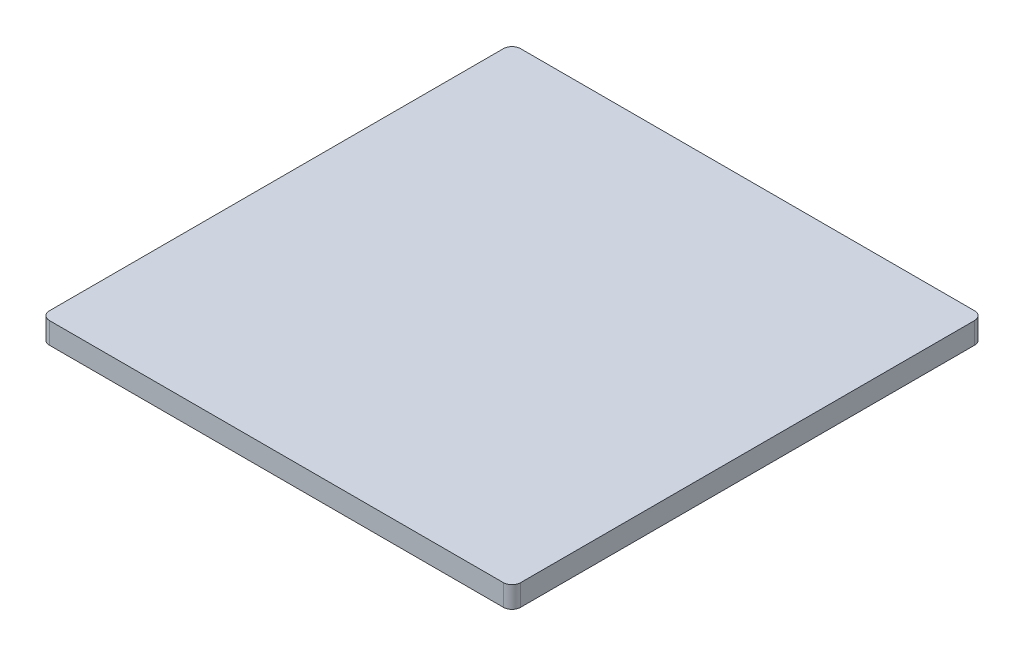
ISO-10303-21;
HEADER;
FILE_DESCRIPTION(('STEP AP214'),'2;1');
FILE_NAME('part.step','',(''),(''),'','','');
FILE_SCHEMA(('AUTOMOTIVE_DESIGN { 1 0 10303 214 1 1 1 1 }'));
ENDSEC;
DATA;
#1=APPLICATION_CONTEXT('core data for automotive mechanical design processes');
#2=APPLICATION_PROTOCOL_DEFINITION('international standard','automotive_design',2000,#1);
#3=PRODUCT_CONTEXT('',#1,'mechanical');
#4=PRODUCT('Part','Part','',(#3));
#5=PRODUCT_RELATED_PRODUCT_CATEGORY('part','',(#4));
#6=PRODUCT_DEFINITION_FORMATION('','',#4);
#7=PRODUCT_DEFINITION_CONTEXT('part definition',#1,'design');
#8=PRODUCT_DEFINITION('design','',#6,#7);
#9=PRODUCT_DEFINITION_SHAPE('','',#8);
#10=(LENGTH_UNIT() NAMED_UNIT(*) SI_UNIT(.MILLI.,.METRE.));
#11=(NAMED_UNIT(*) PLANE_ANGLE_UNIT() SI_UNIT($,.RADIAN.));
#12=(NAMED_UNIT(*) SI_UNIT($,.STERADIAN.) SOLID_ANGLE_UNIT());
#13=UNCERTAINTY_MEASURE_WITH_UNIT(LENGTH_MEASURE(1.E-05),#10,'distance_accuracy_value','');
#14=(GEOMETRIC_REPRESENTATION_CONTEXT(3) GLOBAL_UNCERTAINTY_ASSIGNED_CONTEXT((#13)) GLOBAL_UNIT_ASSIGNED_CONTEXT((#10,
#11,#12)) REPRESENTATION_CONTEXT('',''));
#15=CARTESIAN_POINT('',(0.,0.,0.));
#16=DIRECTION('',(0.,0.,1.));
#17=DIRECTION('',(1.,0.,0.));
#18=AXIS2_PLACEMENT_3D('',#15,#16,#17);
#19=CARTESIAN_POINT('',(54.,2.5,-1.));
#20=DIRECTION('',(0.,-1.,0.));
#21=DIRECTION('',(0.,0.,-1.));
#22=AXIS2_PLACEMENT_3D('',#19,#20,#21);
#23=CYLINDRICAL_SURFACE('',#22,1.);
#24=CARTESIAN_POINT('',(54.,0.,-1.));
#25=DIRECTION('',(0.,1.,0.));
#26=DIRECTION('',(0.,0.,1.));
#27=AXIS2_PLACEMENT_3D('',#24,#25,#26);
#28=CIRCLE('',#27,1.);
#29=CARTESIAN_POINT('',(54.,0.,0.));
#30=VERTEX_POINT('',#29);
#31=CARTESIAN_POINT('',(55.,0.,-1.));
#32=VERTEX_POINT('',#31);
#33=EDGE_CURVE('E137',#30,#32,#28,.T.);
#34=ORIENTED_EDGE('',*,*,#33,.T.);
#35=DIRECTION('',(0.,-1.,0.));
#36=VECTOR('',#35,1.);
#37=CARTESIAN_POINT('',(55.,2.5,-1.));
#38=LINE('',#37,#36);
#39=CARTESIAN_POINT('',(55.,2.5,-1.));
#40=VERTEX_POINT('',#39);
#41=EDGE_CURVE('E11',#40,#32,#38,.T.);
#42=ORIENTED_EDGE('',*,*,#41,.F.);
#43=CARTESIAN_POINT('',(54.,2.5,-1.));
#44=DIRECTION('',(0.,1.,0.));
#45=DIRECTION('',(0.,0.,1.));
#46=AXIS2_PLACEMENT_3D('',#43,#44,#45);
#47=CIRCLE('',#46,1.);
#48=CARTESIAN_POINT('',(54.,2.5,0.));
#49=VERTEX_POINT('',#48);
#50=EDGE_CURVE('E151',#49,#40,#47,.T.);
#51=ORIENTED_EDGE('',*,*,#50,.F.);
#52=DIRECTION('',(0.,-1.,0.));
#53=VECTOR('',#52,1.);
#54=CARTESIAN_POINT('',(54.,2.5,0.));
#55=LINE('',#54,#53);
#56=EDGE_CURVE('E133',#49,#30,#55,.T.);
#57=ORIENTED_EDGE('',*,*,#56,.T.);
#58=EDGE_LOOP('',(#34,#42,#51,#57));
#59=FACE_BOUND('',#58,.T.);
#60=ADVANCED_FACE('F41',(#59),#23,.T.);
#61=CARTESIAN_POINT('',(55.,2.5,-1.));
#62=DIRECTION('',(-1.,0.,0.));
#63=DIRECTION('',(0.,0.,1.));
#64=AXIS2_PLACEMENT_3D('',#61,#62,#63);
#65=PLANE('',#64);
#66=DIRECTION('',(0.,0.,-1.));
#67=VECTOR('',#66,1.);
#68=CARTESIAN_POINT('',(55.,0.,-1.));
#69=LINE('',#68,#67);
#70=CARTESIAN_POINT('',(55.,0.,-54.));
#71=VERTEX_POINT('',#70);
#72=EDGE_CURVE('E140',#32,#71,#69,.T.);
#73=ORIENTED_EDGE('',*,*,#72,.T.);
#74=DIRECTION('',(0.,-1.,0.));
#75=VECTOR('',#74,1.);
#76=CARTESIAN_POINT('',(55.,2.5,-54.));
#77=LINE('',#76,#75);
#78=CARTESIAN_POINT('',(55.,2.5,-54.));
#79=VERTEX_POINT('',#78);
#80=EDGE_CURVE('E49',#79,#71,#77,.T.);
#81=ORIENTED_EDGE('',*,*,#80,.F.);
#82=DIRECTION('',(0.,0.,-1.));
#83=VECTOR('',#82,1.);
#84=CARTESIAN_POINT('',(55.,2.5,-1.));
#85=LINE('',#84,#83);
#86=EDGE_CURVE('E100',#40,#79,#85,.T.);
#87=ORIENTED_EDGE('',*,*,#86,.F.);
#88=ORIENTED_EDGE('',*,*,#41,.T.);
#89=EDGE_LOOP('',(#73,#81,#87,#88));
#90=FACE_BOUND('',#89,.T.);
#91=ADVANCED_FACE('F186',(#90),#65,.F.);
#92=CARTESIAN_POINT('',(54.,2.5,-54.));
#93=DIRECTION('',(0.,-1.,0.));
#94=DIRECTION('',(0.,0.,-1.));
#95=AXIS2_PLACEMENT_3D('',#92,#93,#94);
#96=CYLINDRICAL_SURFACE('',#95,1.);
#97=CARTESIAN_POINT('',(54.,0.,-54.));
#98=DIRECTION('',(0.,1.,0.));
#99=DIRECTION('',(0.,0.,-1.));
#100=AXIS2_PLACEMENT_3D('',#97,#98,#99);
#101=CIRCLE('',#100,1.);
#102=CARTESIAN_POINT('',(54.,0.,-55.));
#103=VERTEX_POINT('',#102);
#104=EDGE_CURVE('E142',#71,#103,#101,.T.);
#105=ORIENTED_EDGE('',*,*,#104,.T.);
#106=DIRECTION('',(0.,-1.,0.));
#107=VECTOR('',#106,1.);
#108=CARTESIAN_POINT('',(54.,2.5,-55.));
#109=LINE('',#108,#107);
#110=CARTESIAN_POINT('',(54.,2.5,-55.));
#111=VERTEX_POINT('',#110);
#112=EDGE_CURVE('E158',#111,#103,#109,.T.);
#113=ORIENTED_EDGE('',*,*,#112,.F.);
#114=CARTESIAN_POINT('',(54.,2.5,-54.));
#115=DIRECTION('',(0.,1.,0.));
#116=DIRECTION('',(0.,0.,-1.));
#117=AXIS2_PLACEMENT_3D('',#114,#115,#116);
#118=CIRCLE('',#117,1.);
#119=EDGE_CURVE('E166',#79,#111,#118,.T.);
#120=ORIENTED_EDGE('',*,*,#119,.F.);
#121=ORIENTED_EDGE('',*,*,#80,.T.);
#122=EDGE_LOOP('',(#105,#113,#120,#121));
#123=FACE_BOUND('',#122,.T.);
#124=ADVANCED_FACE('F164',(#123),#96,.T.);
#125=CARTESIAN_POINT('',(1.,2.5,-55.));
#126=DIRECTION('',(0.,0.,1.));
#127=DIRECTION('',(1.,0.,0.));
#128=AXIS2_PLACEMENT_3D('',#125,#126,#127);
#129=PLANE('',#128);
#130=DIRECTION('',(-1.,0.,0.));
#131=VECTOR('',#130,1.);
#132=CARTESIAN_POINT('',(1.,0.,-55.));
#133=LINE('',#132,#131);
#134=CARTESIAN_POINT('',(1.,0.,-55.));
#135=VERTEX_POINT('',#134);
#136=EDGE_CURVE('E144',#103,#135,#133,.T.);
#137=ORIENTED_EDGE('',*,*,#136,.T.);
#138=DIRECTION('',(0.,-1.,0.));
#139=VECTOR('',#138,1.);
#140=CARTESIAN_POINT('',(1.,2.5,-55.));
#141=LINE('',#140,#139);
#142=CARTESIAN_POINT('',(1.,2.5,-55.));
#143=VERTEX_POINT('',#142);
#144=EDGE_CURVE('E155',#143,#135,#141,.T.);
#145=ORIENTED_EDGE('',*,*,#144,.F.);
#146=DIRECTION('',(-1.,0.,0.));
#147=VECTOR('',#146,1.);
#148=CARTESIAN_POINT('',(1.,2.5,-55.));
#149=LINE('',#148,#147);
#150=EDGE_CURVE('E178',#111,#143,#149,.T.);
#151=ORIENTED_EDGE('',*,*,#150,.F.);
#152=ORIENTED_EDGE('',*,*,#112,.T.);
#153=EDGE_LOOP('',(#137,#145,#151,#152));
#154=FACE_BOUND('',#153,.T.);
#155=ADVANCED_FACE('F174',(#154),#129,.F.);
#156=CARTESIAN_POINT('',(1.,2.5,-54.));
#157=DIRECTION('',(0.,-1.,0.));
#158=DIRECTION('',(0.,0.,-1.));
#159=AXIS2_PLACEMENT_3D('',#156,#157,#158);
#160=CYLINDRICAL_SURFACE('',#159,1.);
#161=CARTESIAN_POINT('',(1.,0.,-54.));
#162=DIRECTION('',(0.,1.,0.));
#163=DIRECTION('',(0.,0.,-1.));
#164=AXIS2_PLACEMENT_3D('',#161,#162,#163);
#165=CIRCLE('',#164,1.);
#166=CARTESIAN_POINT('',(0.,0.,-54.));
#167=VERTEX_POINT('',#166);
#168=EDGE_CURVE('E146',#135,#167,#165,.T.);
#169=ORIENTED_EDGE('',*,*,#168,.T.);
#170=DIRECTION('',(0.,-1.,0.));
#171=VECTOR('',#170,1.);
#172=CARTESIAN_POINT('',(0.,2.5,-54.));
#173=LINE('',#172,#171);
#174=CARTESIAN_POINT('',(0.,2.5,-54.));
#175=VERTEX_POINT('',#174);
#176=EDGE_CURVE('E128',#175,#167,#173,.T.);
#177=ORIENTED_EDGE('',*,*,#176,.F.);
#178=CARTESIAN_POINT('',(1.,2.5,-54.));
#179=DIRECTION('',(0.,1.,0.));
#180=DIRECTION('',(0.,0.,-1.));
#181=AXIS2_PLACEMENT_3D('',#178,#179,#180);
#182=CIRCLE('',#181,1.);
#183=EDGE_CURVE('E119',#143,#175,#182,.T.);
#184=ORIENTED_EDGE('',*,*,#183,.F.);
#185=ORIENTED_EDGE('',*,*,#144,.T.);
#186=EDGE_LOOP('',(#169,#177,#184,#185));
#187=FACE_BOUND('',#186,.T.);
#188=ADVANCED_FACE('F177',(#187),#160,.T.);
#189=CARTESIAN_POINT('',(0.,2.5,-1.00000000000001));
#190=DIRECTION('',(1.,0.,0.));
#191=DIRECTION('',(0.,0.,-1.));
#192=AXIS2_PLACEMENT_3D('',#189,#190,#191);
#193=PLANE('',#192);
#194=DIRECTION('',(0.,0.,1.));
#195=VECTOR('',#194,1.);
#196=CARTESIAN_POINT('',(0.,0.,-1.00000000000001));
#197=LINE('',#196,#195);
#198=CARTESIAN_POINT('',(0.,0.,-1.00000000000001));
#199=VERTEX_POINT('',#198);
#200=EDGE_CURVE('E127',#167,#199,#197,.T.);
#201=ORIENTED_EDGE('',*,*,#200,.T.);
#202=DIRECTION('',(0.,-1.,0.));
#203=VECTOR('',#202,1.);
#204=CARTESIAN_POINT('',(0.,2.5,-1.00000000000001));
#205=LINE('',#204,#203);
#206=CARTESIAN_POINT('',(0.,2.5,-1.00000000000001));
#207=VERTEX_POINT('',#206);
#208=EDGE_CURVE('E124',#207,#199,#205,.T.);
#209=ORIENTED_EDGE('',*,*,#208,.F.);
#210=DIRECTION('',(0.,0.,1.));
#211=VECTOR('',#210,1.);
#212=CARTESIAN_POINT('',(0.,2.5,-1.00000000000001));
#213=LINE('',#212,#211);
#214=EDGE_CURVE('E113',#175,#207,#213,.T.);
#215=ORIENTED_EDGE('',*,*,#214,.F.);
#216=ORIENTED_EDGE('',*,*,#176,.T.);
#217=EDGE_LOOP('',(#201,#209,#215,#216));
#218=FACE_BOUND('',#217,.T.);
#219=ADVANCED_FACE('F125',(#218),#193,.F.);
#220=CARTESIAN_POINT('',(1.,2.5,-1.));
#221=DIRECTION('',(0.,-1.,0.));
#222=DIRECTION('',(0.,0.,-1.));
#223=AXIS2_PLACEMENT_3D('',#220,#221,#222);
#224=CYLINDRICAL_SURFACE('',#223,1.);
#225=CARTESIAN_POINT('',(1.,0.,-1.));
#226=DIRECTION('',(0.,1.,0.));
#227=DIRECTION('',(0.,0.,-1.));
#228=AXIS2_PLACEMENT_3D('',#225,#226,#227);
#229=CIRCLE('',#228,1.);
#230=CARTESIAN_POINT('',(1.00000000000001,0.,0.));
#231=VERTEX_POINT('',#230);
#232=EDGE_CURVE('E86',#199,#231,#229,.T.);
#233=ORIENTED_EDGE('',*,*,#232,.T.);
#234=DIRECTION('',(0.,-1.,0.));
#235=VECTOR('',#234,1.);
#236=CARTESIAN_POINT('',(1.00000000000001,2.5,0.));
#237=LINE('',#236,#235);
#238=CARTESIAN_POINT('',(1.00000000000001,2.5,0.));
#239=VERTEX_POINT('',#238);
#240=EDGE_CURVE('E129',#239,#231,#237,.T.);
#241=ORIENTED_EDGE('',*,*,#240,.F.);
#242=CARTESIAN_POINT('',(1.,2.5,-1.));
#243=DIRECTION('',(0.,1.,0.));
#244=DIRECTION('',(0.,0.,-1.));
#245=AXIS2_PLACEMENT_3D('',#242,#243,#244);
#246=CIRCLE('',#245,1.);
#247=EDGE_CURVE('E117',#207,#239,#246,.T.);
#248=ORIENTED_EDGE('',*,*,#247,.F.);
#249=ORIENTED_EDGE('',*,*,#208,.T.);
#250=EDGE_LOOP('',(#233,#241,#248,#249));
#251=FACE_BOUND('',#250,.T.);
#252=ADVANCED_FACE('F131',(#251),#224,.T.);
#253=CARTESIAN_POINT('',(1.00000000000001,2.5,0.));
#254=DIRECTION('',(0.,0.,-1.));
#255=DIRECTION('',(-1.,0.,0.));
#256=AXIS2_PLACEMENT_3D('',#253,#254,#255);
#257=PLANE('',#256);
#258=DIRECTION('',(1.,0.,0.));
#259=VECTOR('',#258,1.);
#260=CARTESIAN_POINT('',(1.00000000000001,0.,0.));
#261=LINE('',#260,#259);
#262=EDGE_CURVE('E92',#231,#30,#261,.T.);
#263=ORIENTED_EDGE('',*,*,#262,.T.);
#264=ORIENTED_EDGE('',*,*,#56,.F.);
#265=DIRECTION('',(1.,0.,0.));
#266=VECTOR('',#265,1.);
#267=CARTESIAN_POINT('',(1.00000000000001,2.5,0.));
#268=LINE('',#267,#266);
#269=EDGE_CURVE('E57',#239,#49,#268,.T.);
#270=ORIENTED_EDGE('',*,*,#269,.F.);
#271=ORIENTED_EDGE('',*,*,#240,.T.);
#272=EDGE_LOOP('',(#263,#264,#270,#271));
#273=FACE_BOUND('',#272,.T.);
#274=ADVANCED_FACE('F202',(#273),#257,.F.);
#275=CARTESIAN_POINT('',(54.,2.5,-1.));
#276=DIRECTION('',(0.,1.,0.));
#277=DIRECTION('',(0.,0.,1.));
#278=AXIS2_PLACEMENT_3D('',#275,#276,#277);
#279=PLANE('',#278);
#280=ORIENTED_EDGE('',*,*,#50,.T.);
#281=ORIENTED_EDGE('',*,*,#86,.T.);
#282=ORIENTED_EDGE('',*,*,#119,.T.);
#283=ORIENTED_EDGE('',*,*,#150,.T.);
#284=ORIENTED_EDGE('',*,*,#183,.T.);
#285=ORIENTED_EDGE('',*,*,#214,.T.);
#286=ORIENTED_EDGE('',*,*,#247,.T.);
#287=ORIENTED_EDGE('',*,*,#269,.T.);
#288=EDGE_LOOP('',(#280,#281,#282,#283,#284,#285,#286,#287));
#289=FACE_BOUND('',#288,.T.);
#290=ADVANCED_FACE('F115',(#289),#279,.T.);
#291=CARTESIAN_POINT('',(54.,0.,-1.));
#292=DIRECTION('',(0.,1.,0.));
#293=DIRECTION('',(0.,0.,1.));
#294=AXIS2_PLACEMENT_3D('',#291,#292,#293);
#295=PLANE('',#294);
#296=ORIENTED_EDGE('',*,*,#33,.F.);
#297=ORIENTED_EDGE('',*,*,#262,.F.);
#298=ORIENTED_EDGE('',*,*,#232,.F.);
#299=ORIENTED_EDGE('',*,*,#200,.F.);
#300=ORIENTED_EDGE('',*,*,#168,.F.);
#301=ORIENTED_EDGE('',*,*,#136,.F.);
#302=ORIENTED_EDGE('',*,*,#104,.F.);
#303=ORIENTED_EDGE('',*,*,#72,.F.);
#304=EDGE_LOOP('',(#296,#297,#298,#299,#300,#301,#302,#303));
#305=FACE_BOUND('',#304,.T.);
#306=ADVANCED_FACE('F170',(#305),#295,.F.);
#307=CLOSED_SHELL('',(#60,#91,#124,#155,#188,#219,#252,#274,#290,#306));
#308=MANIFOLD_SOLID_BREP('B2',#307);
#309=ADVANCED_BREP_SHAPE_REPRESENTATION('',(#18,#308),#14);
#310=SHAPE_DEFINITION_REPRESENTATION(#9,#309);
ENDSEC;
END-ISO-10303-21;
